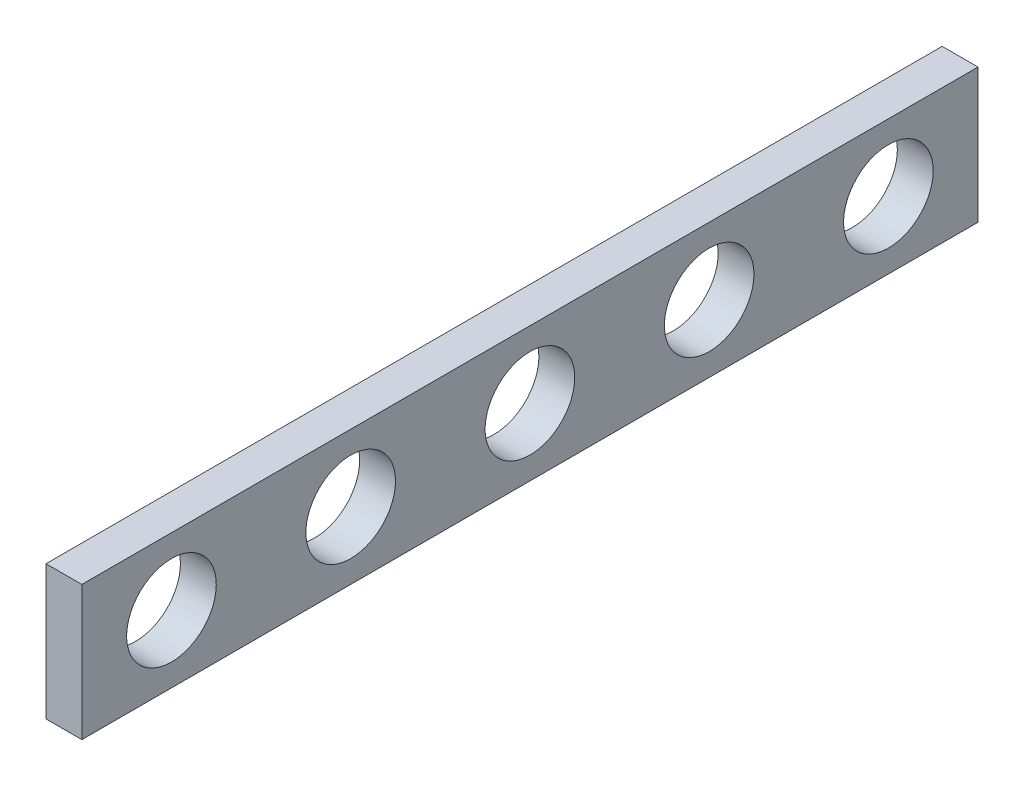
ISO-10303-21;
HEADER;
FILE_DESCRIPTION(('STEP AP214'),'2;1');
FILE_NAME('part.step','',(''),(''),'','','');
FILE_SCHEMA(('AUTOMOTIVE_DESIGN { 1 0 10303 214 1 1 1 1 }'));
ENDSEC;
DATA;
#1=APPLICATION_CONTEXT('core data for automotive mechanical design processes');
#2=APPLICATION_PROTOCOL_DEFINITION('international standard','automotive_design',2000,#1);
#3=PRODUCT_CONTEXT('',#1,'mechanical');
#4=PRODUCT('Part','Part','',(#3));
#5=PRODUCT_RELATED_PRODUCT_CATEGORY('part','',(#4));
#6=PRODUCT_DEFINITION_FORMATION('','',#4);
#7=PRODUCT_DEFINITION_CONTEXT('part definition',#1,'design');
#8=PRODUCT_DEFINITION('design','',#6,#7);
#9=PRODUCT_DEFINITION_SHAPE('','',#8);
#10=(LENGTH_UNIT() NAMED_UNIT(*) SI_UNIT(.MILLI.,.METRE.));
#11=(NAMED_UNIT(*) PLANE_ANGLE_UNIT() SI_UNIT($,.RADIAN.));
#12=(NAMED_UNIT(*) SI_UNIT($,.STERADIAN.) SOLID_ANGLE_UNIT());
#13=UNCERTAINTY_MEASURE_WITH_UNIT(LENGTH_MEASURE(1.E-05),#10,'distance_accuracy_value','');
#14=(GEOMETRIC_REPRESENTATION_CONTEXT(3) GLOBAL_UNCERTAINTY_ASSIGNED_CONTEXT((#13)) GLOBAL_UNIT_ASSIGNED_CONTEXT((#10,
#11,#12)) REPRESENTATION_CONTEXT('',''));
#15=CARTESIAN_POINT('',(0.,0.,0.));
#16=DIRECTION('',(0.,0.,1.));
#17=DIRECTION('',(1.,0.,0.));
#18=AXIS2_PLACEMENT_3D('',#15,#16,#17);
#19=CARTESIAN_POINT('',(20.,0.,0.));
#20=DIRECTION('',(-1.,0.,0.));
#21=DIRECTION('',(0.,0.,1.));
#22=AXIS2_PLACEMENT_3D('',#19,#20,#21);
#23=PLANE('',#22);
#24=DIRECTION('',(0.,1.,0.));
#25=VECTOR('',#24,1.);
#26=CARTESIAN_POINT('',(20.,-37.5,-250.));
#27=LINE('',#26,#25);
#28=CARTESIAN_POINT('',(20.,-37.5,-250.));
#29=VERTEX_POINT('',#28);
#30=CARTESIAN_POINT('',(20.,37.5,-250.));
#31=VERTEX_POINT('',#30);
#32=EDGE_CURVE('E92',#29,#31,#27,.T.);
#33=ORIENTED_EDGE('',*,*,#32,.T.);
#34=DIRECTION('',(0.,0.,1.));
#35=VECTOR('',#34,1.);
#36=CARTESIAN_POINT('',(20.,37.5,250.));
#37=LINE('',#36,#35);
#38=CARTESIAN_POINT('',(20.,37.5,250.));
#39=VERTEX_POINT('',#38);
#40=EDGE_CURVE('E87',#31,#39,#37,.T.);
#41=ORIENTED_EDGE('',*,*,#40,.T.);
#42=DIRECTION('',(0.,-1.,0.));
#43=VECTOR('',#42,1.);
#44=CARTESIAN_POINT('',(20.,-37.5,250.));
#45=LINE('',#44,#43);
#46=CARTESIAN_POINT('',(20.,-37.5,250.));
#47=VERTEX_POINT('',#46);
#48=EDGE_CURVE('E90',#39,#47,#45,.T.);
#49=ORIENTED_EDGE('',*,*,#48,.T.);
#50=DIRECTION('',(0.,0.,-1.));
#51=VECTOR('',#50,1.);
#52=CARTESIAN_POINT('',(20.,-37.5,250.));
#53=LINE('',#52,#51);
#54=EDGE_CURVE('E57',#47,#29,#53,.T.);
#55=ORIENTED_EDGE('',*,*,#54,.T.);
#56=EDGE_LOOP('',(#33,#41,#49,#55));
#57=FACE_BOUND('',#56,.T.);
#58=CARTESIAN_POINT('',(20.,0.,1.11022302462516E-13));
#59=DIRECTION('',(1.,0.,0.));
#60=DIRECTION('',(0.,0.,-1.));
#61=AXIS2_PLACEMENT_3D('',#58,#59,#60);
#62=CIRCLE('',#61,25.);
#63=CARTESIAN_POINT('',(20.,0.,-24.9999999999999));
#64=VERTEX_POINT('',#63);
#65=EDGE_CURVE('E112',#64,#64,#62,.T.);
#66=ORIENTED_EDGE('',*,*,#65,.F.);
#67=EDGE_LOOP('',(#66));
#68=FACE_BOUND('',#67,.T.);
#69=CARTESIAN_POINT('',(20.,0.,-99.9999999999999));
#70=DIRECTION('',(1.,0.,0.));
#71=DIRECTION('',(0.,0.,-1.));
#72=AXIS2_PLACEMENT_3D('',#69,#70,#71);
#73=CIRCLE('',#72,25.);
#74=CARTESIAN_POINT('',(20.,0.,-125.));
#75=VERTEX_POINT('',#74);
#76=EDGE_CURVE('E134',#75,#75,#73,.T.);
#77=ORIENTED_EDGE('',*,*,#76,.F.);
#78=EDGE_LOOP('',(#77));
#79=FACE_BOUND('',#78,.T.);
#80=CARTESIAN_POINT('',(20.,0.,-200.));
#81=DIRECTION('',(1.,0.,0.));
#82=DIRECTION('',(0.,0.,-1.));
#83=AXIS2_PLACEMENT_3D('',#80,#81,#82);
#84=CIRCLE('',#83,25.);
#85=CARTESIAN_POINT('',(20.,0.,-225.));
#86=VERTEX_POINT('',#85);
#87=EDGE_CURVE('E142',#86,#86,#84,.T.);
#88=ORIENTED_EDGE('',*,*,#87,.F.);
#89=EDGE_LOOP('',(#88));
#90=FACE_BOUND('',#89,.T.);
#91=CARTESIAN_POINT('',(20.,-6.98296267768627E-13,100.));
#92=DIRECTION('',(1.,0.,0.));
#93=DIRECTION('',(0.,0.,-1.));
#94=AXIS2_PLACEMENT_3D('',#91,#92,#93);
#95=CIRCLE('',#94,25.);
#96=CARTESIAN_POINT('',(20.,-6.98296267768627E-13,75.0000000000001));
#97=VERTEX_POINT('',#96);
#98=EDGE_CURVE('E150',#97,#97,#95,.T.);
#99=ORIENTED_EDGE('',*,*,#98,.F.);
#100=EDGE_LOOP('',(#99));
#101=FACE_BOUND('',#100,.T.);
#102=CARTESIAN_POINT('',(20.,-1.39659253553725E-12,200.));
#103=DIRECTION('',(1.,0.,0.));
#104=DIRECTION('',(0.,0.,-1.));
#105=AXIS2_PLACEMENT_3D('',#102,#103,#104);
#106=CIRCLE('',#105,25.);
#107=CARTESIAN_POINT('',(20.,-1.39659253553725E-12,175.));
#108=VERTEX_POINT('',#107);
#109=EDGE_CURVE('E158',#108,#108,#106,.T.);
#110=ORIENTED_EDGE('',*,*,#109,.F.);
#111=EDGE_LOOP('',(#110));
#112=FACE_BOUND('',#111,.T.);
#113=ADVANCED_FACE('F39',(#57,#68,#79,#90,#101,#112),#23,.F.);
#114=CARTESIAN_POINT('',(0.,0.,0.));
#115=DIRECTION('',(-1.,0.,0.));
#116=DIRECTION('',(0.,0.,1.));
#117=AXIS2_PLACEMENT_3D('',#114,#115,#116);
#118=PLANE('',#117);
#119=CARTESIAN_POINT('',(0.,-6.98296267768627E-13,100.));
#120=DIRECTION('',(1.,0.,0.));
#121=DIRECTION('',(0.,0.,-1.));
#122=AXIS2_PLACEMENT_3D('',#119,#120,#121);
#123=CIRCLE('',#122,25.);
#124=CARTESIAN_POINT('',(0.,-6.98296267768627E-13,75.0000000000001));
#125=VERTEX_POINT('',#124);
#126=EDGE_CURVE('E154',#125,#125,#123,.T.);
#127=ORIENTED_EDGE('',*,*,#126,.T.);
#128=EDGE_LOOP('',(#127));
#129=FACE_BOUND('',#128,.T.);
#130=CARTESIAN_POINT('',(0.,0.,-99.9999999999999));
#131=DIRECTION('',(1.,0.,0.));
#132=DIRECTION('',(0.,0.,-1.));
#133=AXIS2_PLACEMENT_3D('',#130,#131,#132);
#134=CIRCLE('',#133,25.);
#135=CARTESIAN_POINT('',(0.,0.,-125.));
#136=VERTEX_POINT('',#135);
#137=EDGE_CURVE('E138',#136,#136,#134,.T.);
#138=ORIENTED_EDGE('',*,*,#137,.T.);
#139=EDGE_LOOP('',(#138));
#140=FACE_BOUND('',#139,.T.);
#141=DIRECTION('',(0.,1.,0.));
#142=VECTOR('',#141,1.);
#143=CARTESIAN_POINT('',(0.,-37.5,-250.));
#144=LINE('',#143,#142);
#145=CARTESIAN_POINT('',(0.,-37.5,-250.));
#146=VERTEX_POINT('',#145);
#147=CARTESIAN_POINT('',(0.,37.5,-250.));
#148=VERTEX_POINT('',#147);
#149=EDGE_CURVE('E108',#146,#148,#144,.T.);
#150=ORIENTED_EDGE('',*,*,#149,.F.);
#151=DIRECTION('',(0.,0.,-1.));
#152=VECTOR('',#151,1.);
#153=CARTESIAN_POINT('',(0.,-37.5,250.));
#154=LINE('',#153,#152);
#155=CARTESIAN_POINT('',(0.,-37.5,250.));
#156=VERTEX_POINT('',#155);
#157=EDGE_CURVE('E80',#156,#146,#154,.T.);
#158=ORIENTED_EDGE('',*,*,#157,.F.);
#159=DIRECTION('',(0.,-1.,0.));
#160=VECTOR('',#159,1.);
#161=CARTESIAN_POINT('',(0.,-37.5,250.));
#162=LINE('',#161,#160);
#163=CARTESIAN_POINT('',(0.,37.5,250.));
#164=VERTEX_POINT('',#163);
#165=EDGE_CURVE('E74',#164,#156,#162,.T.);
#166=ORIENTED_EDGE('',*,*,#165,.F.);
#167=DIRECTION('',(0.,0.,1.));
#168=VECTOR('',#167,1.);
#169=CARTESIAN_POINT('',(0.,37.5,250.));
#170=LINE('',#169,#168);
#171=EDGE_CURVE('E97',#148,#164,#170,.T.);
#172=ORIENTED_EDGE('',*,*,#171,.F.);
#173=EDGE_LOOP('',(#150,#158,#166,#172));
#174=FACE_BOUND('',#173,.T.);
#175=CARTESIAN_POINT('',(0.,0.,1.11022302462516E-13));
#176=DIRECTION('',(1.,0.,0.));
#177=DIRECTION('',(0.,0.,-1.));
#178=AXIS2_PLACEMENT_3D('',#175,#176,#177);
#179=CIRCLE('',#178,25.);
#180=CARTESIAN_POINT('',(0.,0.,-24.9999999999999));
#181=VERTEX_POINT('',#180);
#182=EDGE_CURVE('E130',#181,#181,#179,.T.);
#183=ORIENTED_EDGE('',*,*,#182,.T.);
#184=EDGE_LOOP('',(#183));
#185=FACE_BOUND('',#184,.T.);
#186=CARTESIAN_POINT('',(0.,0.,-200.));
#187=DIRECTION('',(1.,0.,0.));
#188=DIRECTION('',(0.,0.,-1.));
#189=AXIS2_PLACEMENT_3D('',#186,#187,#188);
#190=CIRCLE('',#189,25.);
#191=CARTESIAN_POINT('',(0.,0.,-225.));
#192=VERTEX_POINT('',#191);
#193=EDGE_CURVE('E146',#192,#192,#190,.T.);
#194=ORIENTED_EDGE('',*,*,#193,.T.);
#195=EDGE_LOOP('',(#194));
#196=FACE_BOUND('',#195,.T.);
#197=CARTESIAN_POINT('',(0.,-1.39659253553725E-12,200.));
#198=DIRECTION('',(1.,0.,0.));
#199=DIRECTION('',(0.,0.,-1.));
#200=AXIS2_PLACEMENT_3D('',#197,#198,#199);
#201=CIRCLE('',#200,25.);
#202=CARTESIAN_POINT('',(0.,-1.39659253553725E-12,175.));
#203=VERTEX_POINT('',#202);
#204=EDGE_CURVE('E162',#203,#203,#201,.T.);
#205=ORIENTED_EDGE('',*,*,#204,.T.);
#206=EDGE_LOOP('',(#205));
#207=FACE_BOUND('',#206,.T.);
#208=ADVANCED_FACE('F125',(#129,#140,#174,#185,#196,#207),#118,.T.);
#209=CARTESIAN_POINT('',(20.,-37.5,-250.));
#210=DIRECTION('',(0.,0.,1.));
#211=DIRECTION('',(1.,0.,0.));
#212=AXIS2_PLACEMENT_3D('',#209,#210,#211);
#213=PLANE('',#212);
#214=ORIENTED_EDGE('',*,*,#149,.T.);
#215=DIRECTION('',(-1.,0.,0.));
#216=VECTOR('',#215,1.);
#217=CARTESIAN_POINT('',(20.,37.5,-250.));
#218=LINE('',#217,#216);
#219=EDGE_CURVE('E11',#31,#148,#218,.T.);
#220=ORIENTED_EDGE('',*,*,#219,.F.);
#221=ORIENTED_EDGE('',*,*,#32,.F.);
#222=DIRECTION('',(-1.,0.,0.));
#223=VECTOR('',#222,1.);
#224=CARTESIAN_POINT('',(20.,-37.5,-250.));
#225=LINE('',#224,#223);
#226=EDGE_CURVE('E104',#29,#146,#225,.T.);
#227=ORIENTED_EDGE('',*,*,#226,.T.);
#228=EDGE_LOOP('',(#214,#220,#221,#227));
#229=FACE_BOUND('',#228,.T.);
#230=ADVANCED_FACE('F41',(#229),#213,.F.);
#231=CARTESIAN_POINT('',(20.,37.5,250.));
#232=DIRECTION('',(0.,-1.,0.));
#233=DIRECTION('',(0.,0.,-1.));
#234=AXIS2_PLACEMENT_3D('',#231,#232,#233);
#235=PLANE('',#234);
#236=ORIENTED_EDGE('',*,*,#171,.T.);
#237=DIRECTION('',(-1.,0.,0.));
#238=VECTOR('',#237,1.);
#239=CARTESIAN_POINT('',(20.,37.5,250.));
#240=LINE('',#239,#238);
#241=EDGE_CURVE('E49',#39,#164,#240,.T.);
#242=ORIENTED_EDGE('',*,*,#241,.F.);
#243=ORIENTED_EDGE('',*,*,#40,.F.);
#244=ORIENTED_EDGE('',*,*,#219,.T.);
#245=EDGE_LOOP('',(#236,#242,#243,#244));
#246=FACE_BOUND('',#245,.T.);
#247=ADVANCED_FACE('F96',(#246),#235,.F.);
#248=CARTESIAN_POINT('',(20.,-37.5,250.));
#249=DIRECTION('',(0.,0.,-1.));
#250=DIRECTION('',(-1.,0.,0.));
#251=AXIS2_PLACEMENT_3D('',#248,#249,#250);
#252=PLANE('',#251);
#253=ORIENTED_EDGE('',*,*,#165,.T.);
#254=DIRECTION('',(-1.,0.,0.));
#255=VECTOR('',#254,1.);
#256=CARTESIAN_POINT('',(20.,-37.5,250.));
#257=LINE('',#256,#255);
#258=EDGE_CURVE('E99',#47,#156,#257,.T.);
#259=ORIENTED_EDGE('',*,*,#258,.F.);
#260=ORIENTED_EDGE('',*,*,#48,.F.);
#261=ORIENTED_EDGE('',*,*,#241,.T.);
#262=EDGE_LOOP('',(#253,#259,#260,#261));
#263=FACE_BOUND('',#262,.T.);
#264=ADVANCED_FACE('F100',(#263),#252,.F.);
#265=CARTESIAN_POINT('',(20.,-37.5,250.));
#266=DIRECTION('',(0.,1.,0.));
#267=DIRECTION('',(0.,0.,1.));
#268=AXIS2_PLACEMENT_3D('',#265,#266,#267);
#269=PLANE('',#268);
#270=ORIENTED_EDGE('',*,*,#157,.T.);
#271=ORIENTED_EDGE('',*,*,#226,.F.);
#272=ORIENTED_EDGE('',*,*,#54,.F.);
#273=ORIENTED_EDGE('',*,*,#258,.T.);
#274=EDGE_LOOP('',(#270,#271,#272,#273));
#275=FACE_BOUND('',#274,.T.);
#276=ADVANCED_FACE('F122',(#275),#269,.F.);
#277=CARTESIAN_POINT('',(20.,0.,1.11022302462516E-13));
#278=DIRECTION('',(-1.,0.,0.));
#279=DIRECTION('',(0.,0.,1.));
#280=AXIS2_PLACEMENT_3D('',#277,#278,#279);
#281=CYLINDRICAL_SURFACE('',#280,25.);
#282=ORIENTED_EDGE('',*,*,#65,.T.);
#283=EDGE_LOOP('',(#282));
#284=FACE_BOUND('',#283,.T.);
#285=ORIENTED_EDGE('',*,*,#182,.F.);
#286=EDGE_LOOP('',(#285));
#287=FACE_BOUND('',#286,.T.);
#288=ADVANCED_FACE('F181',(#284,#287),#281,.F.);
#289=CARTESIAN_POINT('',(20.,0.,-99.9999999999999));
#290=DIRECTION('',(-1.,0.,0.));
#291=DIRECTION('',(0.,0.,1.));
#292=AXIS2_PLACEMENT_3D('',#289,#290,#291);
#293=CYLINDRICAL_SURFACE('',#292,25.);
#294=ORIENTED_EDGE('',*,*,#76,.T.);
#295=EDGE_LOOP('',(#294));
#296=FACE_BOUND('',#295,.T.);
#297=ORIENTED_EDGE('',*,*,#137,.F.);
#298=EDGE_LOOP('',(#297));
#299=FACE_BOUND('',#298,.T.);
#300=ADVANCED_FACE('F227',(#296,#299),#293,.F.);
#301=CARTESIAN_POINT('',(20.,0.,-200.));
#302=DIRECTION('',(-1.,0.,0.));
#303=DIRECTION('',(0.,0.,1.));
#304=AXIS2_PLACEMENT_3D('',#301,#302,#303);
#305=CYLINDRICAL_SURFACE('',#304,25.);
#306=ORIENTED_EDGE('',*,*,#87,.T.);
#307=EDGE_LOOP('',(#306));
#308=FACE_BOUND('',#307,.T.);
#309=ORIENTED_EDGE('',*,*,#193,.F.);
#310=EDGE_LOOP('',(#309));
#311=FACE_BOUND('',#310,.T.);
#312=ADVANCED_FACE('F235',(#308,#311),#305,.F.);
#313=CARTESIAN_POINT('',(20.,-6.98296267768627E-13,100.));
#314=DIRECTION('',(-1.,0.,0.));
#315=DIRECTION('',(0.,0.,1.));
#316=AXIS2_PLACEMENT_3D('',#313,#314,#315);
#317=CYLINDRICAL_SURFACE('',#316,25.);
#318=ORIENTED_EDGE('',*,*,#98,.T.);
#319=EDGE_LOOP('',(#318));
#320=FACE_BOUND('',#319,.T.);
#321=ORIENTED_EDGE('',*,*,#126,.F.);
#322=EDGE_LOOP('',(#321));
#323=FACE_BOUND('',#322,.T.);
#324=ADVANCED_FACE('F243',(#320,#323),#317,.F.);
#325=CARTESIAN_POINT('',(20.,-1.39659253553725E-12,200.));
#326=DIRECTION('',(-1.,0.,0.));
#327=DIRECTION('',(0.,0.,1.));
#328=AXIS2_PLACEMENT_3D('',#325,#326,#327);
#329=CYLINDRICAL_SURFACE('',#328,25.);
#330=ORIENTED_EDGE('',*,*,#109,.T.);
#331=EDGE_LOOP('',(#330));
#332=FACE_BOUND('',#331,.T.);
#333=ORIENTED_EDGE('',*,*,#204,.F.);
#334=EDGE_LOOP('',(#333));
#335=FACE_BOUND('',#334,.T.);
#336=ADVANCED_FACE('F170',(#332,#335),#329,.F.);
#337=CLOSED_SHELL('',(#113,#208,#230,#247,#264,#276,#288,#300,#312,#324,#336));
#338=MANIFOLD_SOLID_BREP('B2',#337);
#339=ADVANCED_BREP_SHAPE_REPRESENTATION('',(#18,#338),#14);
#340=SHAPE_DEFINITION_REPRESENTATION(#9,#339);
ENDSEC;
END-ISO-10303-21;
